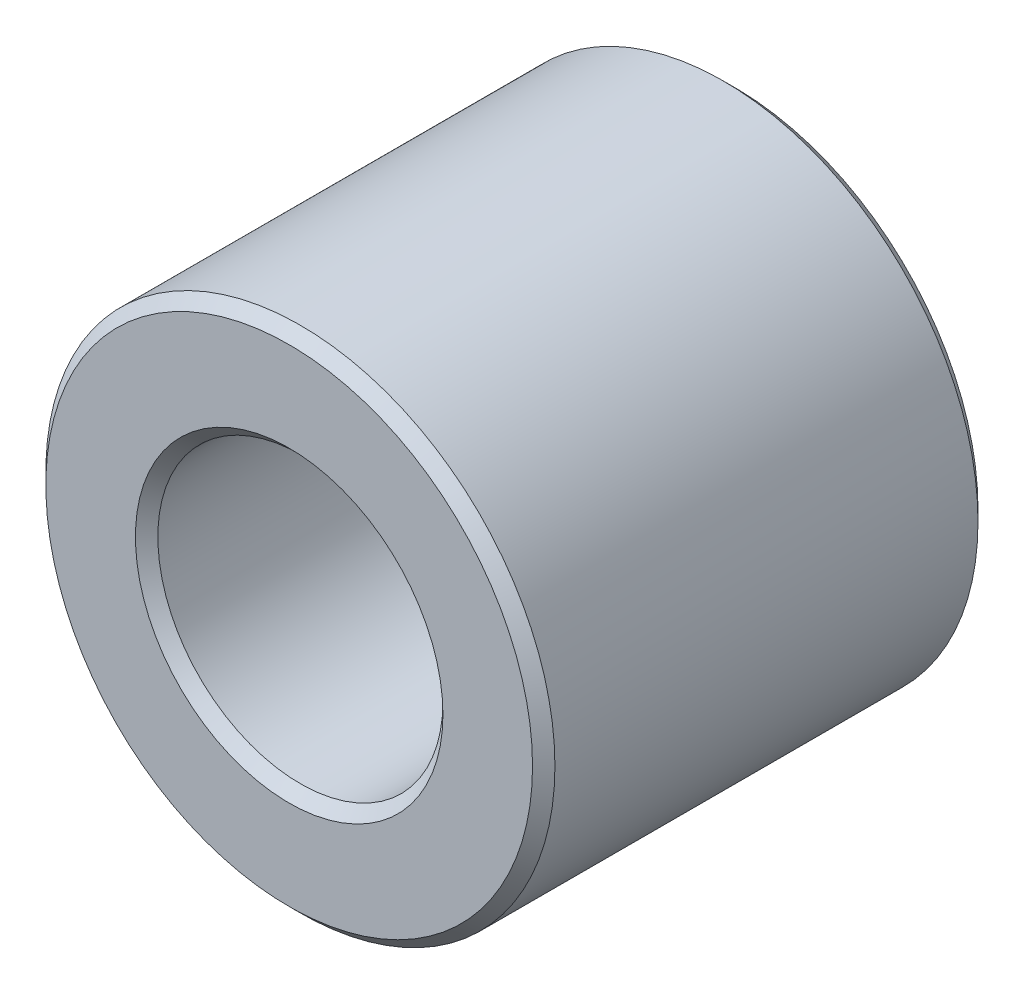
ISO-10303-21;
HEADER;
FILE_DESCRIPTION(('STEP AP214'),'2;1');
FILE_NAME('part.step','',(''),(''),'','','');
FILE_SCHEMA(('AUTOMOTIVE_DESIGN { 1 0 10303 214 1 1 1 1 }'));
ENDSEC;
DATA;
#1=APPLICATION_CONTEXT('core data for automotive mechanical design processes');
#2=APPLICATION_PROTOCOL_DEFINITION('international standard','automotive_design',2000,#1);
#3=PRODUCT_CONTEXT('',#1,'mechanical');
#4=PRODUCT('Part','Part','',(#3));
#5=PRODUCT_RELATED_PRODUCT_CATEGORY('part','',(#4));
#6=PRODUCT_DEFINITION_FORMATION('','',#4);
#7=PRODUCT_DEFINITION_CONTEXT('part definition',#1,'design');
#8=PRODUCT_DEFINITION('design','',#6,#7);
#9=PRODUCT_DEFINITION_SHAPE('','',#8);
#10=(LENGTH_UNIT() NAMED_UNIT(*) SI_UNIT(.MILLI.,.METRE.));
#11=(NAMED_UNIT(*) PLANE_ANGLE_UNIT() SI_UNIT($,.RADIAN.));
#12=(NAMED_UNIT(*) SI_UNIT($,.STERADIAN.) SOLID_ANGLE_UNIT());
#13=UNCERTAINTY_MEASURE_WITH_UNIT(LENGTH_MEASURE(1.E-05),#10,'distance_accuracy_value','');
#14=(GEOMETRIC_REPRESENTATION_CONTEXT(3) GLOBAL_UNCERTAINTY_ASSIGNED_CONTEXT((#13)) GLOBAL_UNIT_ASSIGNED_CONTEXT((#10,
#11,#12)) REPRESENTATION_CONTEXT('',''));
#15=CARTESIAN_POINT('',(0.,0.,0.));
#16=DIRECTION('',(0.,0.,1.));
#17=DIRECTION('',(1.,0.,0.));
#18=AXIS2_PLACEMENT_3D('',#15,#16,#17);
#19=CARTESIAN_POINT('',(0.,0.,-2.778125));
#20=DIRECTION('',(0.,0.,1.));
#21=DIRECTION('',(1.,0.,0.));
#22=AXIS2_PLACEMENT_3D('',#19,#20,#21);
#23=CYLINDRICAL_SURFACE('',#22,3.175);
#24=CARTESIAN_POINT('',(0.,0.,2.638425));
#25=DIRECTION('',(0.,0.,1.));
#26=DIRECTION('',(1.,0.,0.));
#27=AXIS2_PLACEMENT_3D('',#24,#25,#26);
#28=CIRCLE('',#27,3.175);
#29=CARTESIAN_POINT('',(3.175,0.,2.638425));
#30=VERTEX_POINT('',#29);
#31=EDGE_CURVE('E55',#30,#30,#28,.F.);
#32=ORIENTED_EDGE('',*,*,#31,.T.);
#33=EDGE_LOOP('',(#32));
#34=FACE_BOUND('',#33,.T.);
#35=CARTESIAN_POINT('',(0.,0.,-2.638425));
#36=DIRECTION('',(0.,0.,1.));
#37=DIRECTION('',(1.,0.,0.));
#38=AXIS2_PLACEMENT_3D('',#35,#36,#37);
#39=CIRCLE('',#38,3.175);
#40=CARTESIAN_POINT('',(3.175,0.,-2.638425));
#41=VERTEX_POINT('',#40);
#42=EDGE_CURVE('E58',#41,#41,#39,.T.);
#43=ORIENTED_EDGE('',*,*,#42,.T.);
#44=EDGE_LOOP('',(#43));
#45=FACE_BOUND('',#44,.T.);
#46=ADVANCED_FACE('F35',(#34,#45),#23,.T.);
#47=CARTESIAN_POINT('',(0.,0.,-2.778125));
#48=DIRECTION('',(0.,0.,1.));
#49=DIRECTION('',(1.,0.,0.));
#50=AXIS2_PLACEMENT_3D('',#47,#48,#49);
#51=PLANE('',#50);
#52=CARTESIAN_POINT('',(0.,0.,-2.778125));
#53=DIRECTION('',(0.,0.,1.));
#54=DIRECTION('',(1.,0.,0.));
#55=AXIS2_PLACEMENT_3D('',#52,#53,#54);
#56=CIRCLE('',#55,3.0353);
#57=CARTESIAN_POINT('',(3.0353,0.,-2.778125));
#58=VERTEX_POINT('',#57);
#59=EDGE_CURVE('E46',#58,#58,#56,.F.);
#60=ORIENTED_EDGE('',*,*,#59,.T.);
#61=EDGE_LOOP('',(#60));
#62=FACE_BOUND('',#61,.T.);
#63=CARTESIAN_POINT('',(0.,0.,-2.778125));
#64=DIRECTION('',(0.,0.,1.));
#65=DIRECTION('',(1.,0.,0.));
#66=AXIS2_PLACEMENT_3D('',#63,#64,#65);
#67=CIRCLE('',#66,1.9177);
#68=CARTESIAN_POINT('',(1.9177,0.,-2.778125));
#69=VERTEX_POINT('',#68);
#70=EDGE_CURVE('E50',#69,#69,#67,.T.);
#71=ORIENTED_EDGE('',*,*,#70,.T.);
#72=EDGE_LOOP('',(#71));
#73=FACE_BOUND('',#72,.T.);
#74=ADVANCED_FACE('F83',(#62,#73),#51,.F.);
#75=CARTESIAN_POINT('',(0.,0.,-2.778125));
#76=DIRECTION('',(0.,0.,1.));
#77=DIRECTION('',(1.,0.,0.));
#78=AXIS2_PLACEMENT_3D('',#75,#76,#77);
#79=CYLINDRICAL_SURFACE('',#78,1.778);
#80=CARTESIAN_POINT('',(0.,0.,2.638425));
#81=DIRECTION('',(0.,0.,1.));
#82=DIRECTION('',(1.,0.,0.));
#83=AXIS2_PLACEMENT_3D('',#80,#81,#82);
#84=CIRCLE('',#83,1.778);
#85=CARTESIAN_POINT('',(1.778,0.,2.638425));
#86=VERTEX_POINT('',#85);
#87=EDGE_CURVE('E10',#86,#86,#84,.T.);
#88=ORIENTED_EDGE('',*,*,#87,.T.);
#89=EDGE_LOOP('',(#88));
#90=FACE_BOUND('',#89,.T.);
#91=CARTESIAN_POINT('',(0.,0.,-2.638425));
#92=DIRECTION('',(0.,0.,1.));
#93=DIRECTION('',(1.,0.,0.));
#94=AXIS2_PLACEMENT_3D('',#91,#92,#93);
#95=CIRCLE('',#94,1.778);
#96=CARTESIAN_POINT('',(1.778,0.,-2.638425));
#97=VERTEX_POINT('',#96);
#98=EDGE_CURVE('E42',#97,#97,#95,.F.);
#99=ORIENTED_EDGE('',*,*,#98,.T.);
#100=EDGE_LOOP('',(#99));
#101=FACE_BOUND('',#100,.T.);
#102=ADVANCED_FACE('F89',(#90,#101),#79,.F.);
#103=CARTESIAN_POINT('',(0.,0.,2.778125));
#104=DIRECTION('',(0.,0.,1.));
#105=DIRECTION('',(1.,0.,0.));
#106=AXIS2_PLACEMENT_3D('',#103,#104,#105);
#107=PLANE('',#106);
#108=CARTESIAN_POINT('',(0.,0.,2.778125));
#109=DIRECTION('',(0.,0.,1.));
#110=DIRECTION('',(1.,0.,0.));
#111=AXIS2_PLACEMENT_3D('',#108,#109,#110);
#112=CIRCLE('',#111,3.0353);
#113=CARTESIAN_POINT('',(3.0353,0.,2.778125));
#114=VERTEX_POINT('',#113);
#115=EDGE_CURVE('E61',#114,#114,#112,.T.);
#116=ORIENTED_EDGE('',*,*,#115,.T.);
#117=EDGE_LOOP('',(#116));
#118=FACE_BOUND('',#117,.T.);
#119=CARTESIAN_POINT('',(0.,0.,2.778125));
#120=DIRECTION('',(0.,0.,1.));
#121=DIRECTION('',(1.,0.,0.));
#122=AXIS2_PLACEMENT_3D('',#119,#120,#121);
#123=CIRCLE('',#122,1.9177);
#124=CARTESIAN_POINT('',(1.9177,0.,2.778125));
#125=VERTEX_POINT('',#124);
#126=EDGE_CURVE('E64',#125,#125,#123,.F.);
#127=ORIENTED_EDGE('',*,*,#126,.T.);
#128=EDGE_LOOP('',(#127));
#129=FACE_BOUND('',#128,.T.);
#130=ADVANCED_FACE('F68',(#118,#129),#107,.T.);
#131=CARTESIAN_POINT('',(0.,0.,2.778125));
#132=DIRECTION('',(0.,0.,-1.));
#133=DIRECTION('',(-1.,0.,0.));
#134=AXIS2_PLACEMENT_3D('',#131,#132,#133);
#135=CONICAL_SURFACE('',#134,3.0353,0.785398163397451);
#136=ORIENTED_EDGE('',*,*,#31,.F.);
#137=EDGE_LOOP('',(#136));
#138=FACE_BOUND('',#137,.T.);
#139=ORIENTED_EDGE('',*,*,#115,.F.);
#140=EDGE_LOOP('',(#139));
#141=FACE_BOUND('',#140,.T.);
#142=ADVANCED_FACE('F79',(#138,#141),#135,.T.);
#143=CARTESIAN_POINT('',(0.,0.,-2.638425));
#144=DIRECTION('',(0.,0.,1.));
#145=DIRECTION('',(1.,0.,0.));
#146=AXIS2_PLACEMENT_3D('',#143,#144,#145);
#147=CONICAL_SURFACE('',#146,3.175,0.785398163397453);
#148=ORIENTED_EDGE('',*,*,#59,.F.);
#149=EDGE_LOOP('',(#148));
#150=FACE_BOUND('',#149,.T.);
#151=ORIENTED_EDGE('',*,*,#42,.F.);
#152=EDGE_LOOP('',(#151));
#153=FACE_BOUND('',#152,.T.);
#154=ADVANCED_FACE('F73',(#150,#153),#147,.T.);
#155=CARTESIAN_POINT('',(0.,0.,2.638425));
#156=DIRECTION('',(0.,0.,1.));
#157=DIRECTION('',(1.,0.,0.));
#158=AXIS2_PLACEMENT_3D('',#155,#156,#157);
#159=CONICAL_SURFACE('',#158,1.778,0.785398163397448);
#160=ORIENTED_EDGE('',*,*,#126,.F.);
#161=EDGE_LOOP('',(#160));
#162=FACE_BOUND('',#161,.T.);
#163=ORIENTED_EDGE('',*,*,#87,.F.);
#164=EDGE_LOOP('',(#163));
#165=FACE_BOUND('',#164,.T.);
#166=ADVANCED_FACE('F70',(#162,#165),#159,.F.);
#167=CARTESIAN_POINT('',(0.,0.,-2.778125));
#168=DIRECTION('',(0.,0.,-1.));
#169=DIRECTION('',(-1.,0.,0.));
#170=AXIS2_PLACEMENT_3D('',#167,#168,#169);
#171=CONICAL_SURFACE('',#170,1.9177,0.785398163397445);
#172=ORIENTED_EDGE('',*,*,#98,.F.);
#173=EDGE_LOOP('',(#172));
#174=FACE_BOUND('',#173,.T.);
#175=ORIENTED_EDGE('',*,*,#70,.F.);
#176=EDGE_LOOP('',(#175));
#177=FACE_BOUND('',#176,.T.);
#178=ADVANCED_FACE('F37',(#174,#177),#171,.F.);
#179=CLOSED_SHELL('',(#46,#74,#102,#130,#142,#154,#166,#178));
#180=MANIFOLD_SOLID_BREP('B2',#179);
#181=ADVANCED_BREP_SHAPE_REPRESENTATION('',(#18,#180),#14);
#182=SHAPE_DEFINITION_REPRESENTATION(#9,#181);
ENDSEC;
END-ISO-10303-21;
